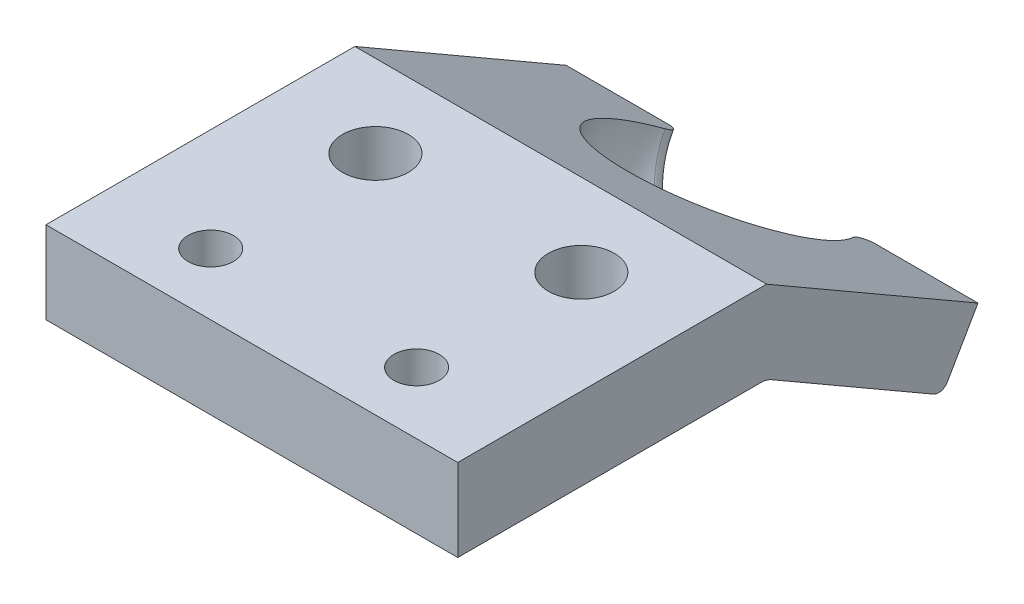
ISO-10303-21;
HEADER;
FILE_DESCRIPTION(('STEP AP214'),'2;1');
FILE_NAME('part.step','',(''),(''),'','','');
FILE_SCHEMA(('AUTOMOTIVE_DESIGN { 1 0 10303 214 1 1 1 1 }'));
ENDSEC;
DATA;
#1=APPLICATION_CONTEXT('core data for automotive mechanical design processes');
#2=APPLICATION_PROTOCOL_DEFINITION('international standard','automotive_design',2000,#1);
#3=PRODUCT_CONTEXT('',#1,'mechanical');
#4=PRODUCT('Part','Part','',(#3));
#5=PRODUCT_RELATED_PRODUCT_CATEGORY('part','',(#4));
#6=PRODUCT_DEFINITION_FORMATION('','',#4);
#7=PRODUCT_DEFINITION_CONTEXT('part definition',#1,'design');
#8=PRODUCT_DEFINITION('design','',#6,#7);
#9=PRODUCT_DEFINITION_SHAPE('','',#8);
#10=(LENGTH_UNIT() NAMED_UNIT(*) SI_UNIT(.MILLI.,.METRE.));
#11=(NAMED_UNIT(*) PLANE_ANGLE_UNIT() SI_UNIT($,.RADIAN.));
#12=(NAMED_UNIT(*) SI_UNIT($,.STERADIAN.) SOLID_ANGLE_UNIT());
#13=UNCERTAINTY_MEASURE_WITH_UNIT(LENGTH_MEASURE(1.E-05),#10,'distance_accuracy_value','');
#14=(GEOMETRIC_REPRESENTATION_CONTEXT(3) GLOBAL_UNCERTAINTY_ASSIGNED_CONTEXT((#13)) GLOBAL_UNIT_ASSIGNED_CONTEXT((#10,
#11,#12)) REPRESENTATION_CONTEXT('',''));
#15=CARTESIAN_POINT('',(0.,0.,0.));
#16=DIRECTION('',(0.,0.,1.));
#17=DIRECTION('',(1.,0.,0.));
#18=AXIS2_PLACEMENT_3D('',#15,#16,#17);
#19=CARTESIAN_POINT('',(-10.,1.07179676972454,-52.));
#20=DIRECTION('',(0.,-0.499999999999998,-0.86602540378444));
#21=DIRECTION('',(0.,0.86602540378444,-0.499999999999998));
#22=AXIS2_PLACEMENT_3D('',#19,#20,#21);
#23=PLANE('',#22);
#24=DIRECTION('',(1.,0.,0.));
#25=VECTOR('',#24,1.);
#26=CARTESIAN_POINT('',(-40.4145188432738,-1.92820323027547,-50.2679491924311));
#27=LINE('',#26,#25);
#28=CARTESIAN_POINT('',(-10.,-1.92820323027547,-50.2679491924311));
#29=VERTEX_POINT('',#28);
#30=CARTESIAN_POINT('',(-5.01098792654702,-1.92820323027548,-50.2679491924311));
#31=VERTEX_POINT('',#30);
#32=EDGE_CURVE('E153',#29,#31,#27,.T.);
#33=ORIENTED_EDGE('',*,*,#32,.T.);
#34=CARTESIAN_POINT('',(0.,-1.92820323027548,-50.2679491924311));
#35=DIRECTION('',(0.,-0.499999999999998,-0.86602540378444));
#36=DIRECTION('',(0.,0.86602540378444,-0.499999999999998));
#37=AXIS2_PLACEMENT_3D('',#34,#35,#36);
#38=CIRCLE('',#37,5.01098792654702);
#39=CARTESIAN_POINT('',(-4.04030959397146,-4.49519052838326,-48.7858983848622));
#40=VERTEX_POINT('',#39);
#41=EDGE_CURVE('E231',#31,#40,#38,.F.);
#42=ORIENTED_EDGE('',*,*,#41,.T.);
#43=DIRECTION('',(1.,0.,0.));
#44=VECTOR('',#43,1.);
#45=CARTESIAN_POINT('',(-10.,-4.49519052838326,-48.7858983848622));
#46=LINE('',#45,#44);
#47=CARTESIAN_POINT('',(-10.,-4.49519052838326,-48.7858983848622));
#48=VERTEX_POINT('',#47);
#49=EDGE_CURVE('E234',#40,#48,#46,.F.);
#50=ORIENTED_EDGE('',*,*,#49,.T.);
#51=DIRECTION('',(0.,0.86602540378444,-0.499999999999998));
#52=VECTOR('',#51,1.);
#53=CARTESIAN_POINT('',(-10.,1.07179676972454,-52.));
#54=LINE('',#53,#52);
#55=EDGE_CURVE('E208',#48,#29,#54,.T.);
#56=ORIENTED_EDGE('',*,*,#55,.T.);
#57=EDGE_LOOP('',(#33,#42,#50,#56));
#58=FACE_BOUND('',#57,.T.);
#59=ADVANCED_FACE('F38',(#58),#23,.T.);
#60=CARTESIAN_POINT('',(0.,0.,0.));
#61=DIRECTION('',(0.,1.,0.));
#62=DIRECTION('',(0.,0.,1.));
#63=AXIS2_PLACEMENT_3D('',#60,#61,#62);
#64=PLANE('',#63);
#65=CARTESIAN_POINT('',(5.,0.,-36.));
#66=DIRECTION('',(0.,1.,0.));
#67=DIRECTION('',(0.,0.,1.));
#68=AXIS2_PLACEMENT_3D('',#65,#66,#67);
#69=CIRCLE('',#68,1.6);
#70=CARTESIAN_POINT('',(5.,0.,-34.4));
#71=VERTEX_POINT('',#70);
#72=EDGE_CURVE('E257',#71,#71,#69,.T.);
#73=ORIENTED_EDGE('',*,*,#72,.T.);
#74=EDGE_LOOP('',(#73));
#75=FACE_BOUND('',#74,.T.);
#76=CARTESIAN_POINT('',(-5.,0.,-28.));
#77=DIRECTION('',(0.,1.,0.));
#78=DIRECTION('',(0.,0.,1.));
#79=AXIS2_PLACEMENT_3D('',#76,#77,#78);
#80=CIRCLE('',#79,1.1);
#81=CARTESIAN_POINT('',(-5.,0.,-26.9));
#82=VERTEX_POINT('',#81);
#83=EDGE_CURVE('E283',#82,#82,#80,.T.);
#84=ORIENTED_EDGE('',*,*,#83,.T.);
#85=EDGE_LOOP('',(#84));
#86=FACE_BOUND('',#85,.T.);
#87=CARTESIAN_POINT('',(5.,0.,-28.));
#88=DIRECTION('',(0.,1.,0.));
#89=DIRECTION('',(0.,0.,1.));
#90=AXIS2_PLACEMENT_3D('',#87,#88,#89);
#91=CIRCLE('',#90,1.1);
#92=CARTESIAN_POINT('',(5.,0.,-26.9));
#93=VERTEX_POINT('',#92);
#94=EDGE_CURVE('E279',#93,#93,#91,.T.);
#95=ORIENTED_EDGE('',*,*,#94,.T.);
#96=EDGE_LOOP('',(#95));
#97=FACE_BOUND('',#96,.T.);
#98=CARTESIAN_POINT('',(-5.,0.,-36.));
#99=DIRECTION('',(0.,1.,0.));
#100=DIRECTION('',(0.,0.,1.));
#101=AXIS2_PLACEMENT_3D('',#98,#99,#100);
#102=CIRCLE('',#101,1.6);
#103=CARTESIAN_POINT('',(-5.,0.,-34.4));
#104=VERTEX_POINT('',#103);
#105=EDGE_CURVE('E155',#104,#104,#102,.T.);
#106=ORIENTED_EDGE('',*,*,#105,.T.);
#107=EDGE_LOOP('',(#106));
#108=FACE_BOUND('',#107,.T.);
#109=DIRECTION('',(0.,0.,-1.));
#110=VECTOR('',#109,1.);
#111=CARTESIAN_POINT('',(-10.,0.,0.));
#112=LINE('',#111,#110);
#113=CARTESIAN_POINT('',(-10.,0.,-25.));
#114=VERTEX_POINT('',#113);
#115=CARTESIAN_POINT('',(-10.,0.,-39.7320508075689));
#116=VERTEX_POINT('',#115);
#117=EDGE_CURVE('E175',#114,#116,#112,.T.);
#118=ORIENTED_EDGE('',*,*,#117,.T.);
#119=DIRECTION('',(1.,0.,0.));
#120=VECTOR('',#119,1.);
#121=CARTESIAN_POINT('',(0.,0.,-39.7320508075689));
#122=LINE('',#121,#120);
#123=CARTESIAN_POINT('',(10.,0.,-39.7320508075689));
#124=VERTEX_POINT('',#123);
#125=EDGE_CURVE('E295',#116,#124,#122,.T.);
#126=ORIENTED_EDGE('',*,*,#125,.T.);
#127=DIRECTION('',(0.,0.,1.));
#128=VECTOR('',#127,1.);
#129=CARTESIAN_POINT('',(9.99999999999999,0.,0.));
#130=LINE('',#129,#128);
#131=CARTESIAN_POINT('',(10.,0.,-25.));
#132=VERTEX_POINT('',#131);
#133=EDGE_CURVE('E326',#124,#132,#130,.T.);
#134=ORIENTED_EDGE('',*,*,#133,.T.);
#135=DIRECTION('',(1.,0.,0.));
#136=VECTOR('',#135,1.);
#137=CARTESIAN_POINT('',(-40.4145188432738,0.,-25.));
#138=LINE('',#137,#136);
#139=EDGE_CURVE('E168',#114,#132,#138,.T.);
#140=ORIENTED_EDGE('',*,*,#139,.F.);
#141=EDGE_LOOP('',(#118,#126,#134,#140));
#142=FACE_BOUND('',#141,.T.);
#143=ADVANCED_FACE('F324',(#75,#86,#97,#108,#142),#64,.F.);
#144=CARTESIAN_POINT('',(5.01098792654702,-1.92820323027548,-50.2679491924311));
#145=VERTEX_POINT('',#144);
#146=CARTESIAN_POINT('',(10.,-1.92820323027547,-50.2679491924311));
#147=VERTEX_POINT('',#146);
#148=EDGE_CURVE('E161',#145,#147,#27,.T.);
#149=ORIENTED_EDGE('',*,*,#148,.T.);
#150=DIRECTION('',(0.,0.86602540378444,-0.499999999999998));
#151=VECTOR('',#150,1.);
#152=CARTESIAN_POINT('',(10.,1.07179676972454,-52.));
#153=LINE('',#152,#151);
#154=CARTESIAN_POINT('',(10.,-4.49519052838326,-48.7858983848622));
#155=VERTEX_POINT('',#154);
#156=EDGE_CURVE('E200',#155,#147,#153,.T.);
#157=ORIENTED_EDGE('',*,*,#156,.F.);
#158=DIRECTION('',(1.,0.,0.));
#159=VECTOR('',#158,1.);
#160=CARTESIAN_POINT('',(-10.,-4.49519052838326,-48.7858983848622));
#161=LINE('',#160,#159);
#162=CARTESIAN_POINT('',(4.04030959397146,-4.49519052838326,-48.7858983848622));
#163=VERTEX_POINT('',#162);
#164=EDGE_CURVE('E228',#155,#163,#161,.F.);
#165=ORIENTED_EDGE('',*,*,#164,.T.);
#166=CARTESIAN_POINT('',(0.,-1.92820323027548,-50.2679491924311));
#167=DIRECTION('',(0.,-0.499999999999998,-0.86602540378444));
#168=DIRECTION('',(0.,0.86602540378444,-0.499999999999998));
#169=AXIS2_PLACEMENT_3D('',#166,#167,#168);
#170=CIRCLE('',#169,5.01098792654702);
#171=EDGE_CURVE('E224',#163,#145,#170,.F.);
#172=ORIENTED_EDGE('',*,*,#171,.T.);
#173=EDGE_LOOP('',(#149,#157,#165,#172));
#174=FACE_BOUND('',#173,.T.);
#175=ADVANCED_FACE('F356',(#174),#23,.T.);
#176=CARTESIAN_POINT('',(-10.,0.,-40.));
#177=DIRECTION('',(0.,-0.86602540378444,0.499999999999998));
#178=DIRECTION('',(0.,-0.499999999999998,-0.86602540378444));
#179=AXIS2_PLACEMENT_3D('',#176,#177,#178);
#180=PLANE('',#179);
#181=DIRECTION('',(0.,-0.499999999999998,-0.86602540378444));
#182=VECTOR('',#181,1.);
#183=CARTESIAN_POINT('',(10.,0.,-40.));
#184=LINE('',#183,#182);
#185=CARTESIAN_POINT('',(10.,-0.13397459621556,-40.2320508075689));
#186=VERTEX_POINT('',#185);
#187=CARTESIAN_POINT('',(10.,-4.67820323027548,-48.10288568297));
#188=VERTEX_POINT('',#187);
#189=EDGE_CURVE('E197',#186,#188,#184,.T.);
#190=ORIENTED_EDGE('',*,*,#189,.F.);
#191=DIRECTION('',(1.,0.,0.));
#192=VECTOR('',#191,1.);
#193=CARTESIAN_POINT('',(-10.,-0.13397459621556,-40.2320508075689));
#194=LINE('',#193,#192);
#195=CARTESIAN_POINT('',(-10.,-0.13397459621556,-40.2320508075689));
#196=VERTEX_POINT('',#195);
#197=EDGE_CURVE('E54',#186,#196,#194,.F.);
#198=ORIENTED_EDGE('',*,*,#197,.T.);
#199=DIRECTION('',(0.,-0.499999999999998,-0.86602540378444));
#200=VECTOR('',#199,1.);
#201=CARTESIAN_POINT('',(-10.,0.,-40.));
#202=LINE('',#201,#200);
#203=CARTESIAN_POINT('',(-10.,-4.67820323027548,-48.10288568297));
#204=VERTEX_POINT('',#203);
#205=EDGE_CURVE('E205',#196,#204,#202,.T.);
#206=ORIENTED_EDGE('',*,*,#205,.T.);
#207=DIRECTION('',(1.,0.,0.));
#208=VECTOR('',#207,1.);
#209=CARTESIAN_POINT('',(-10.,-4.67820323027548,-48.10288568297));
#210=LINE('',#209,#208);
#211=CARTESIAN_POINT('',(-4.04030959397146,-4.67820323027548,-48.10288568297));
#212=VERTEX_POINT('',#211);
#213=EDGE_CURVE('E214',#204,#212,#210,.T.);
#214=ORIENTED_EDGE('',*,*,#213,.T.);
#215=CARTESIAN_POINT('',(0.,-3.42820323027549,-45.9378221735089));
#216=DIRECTION('',(0.,-0.86602540378444,0.499999999999998));
#217=DIRECTION('',(0.,-0.499999999999998,-0.86602540378444));
#218=AXIS2_PLACEMENT_3D('',#215,#216,#217);
#219=CIRCLE('',#218,4.75122106569856);
#220=CARTESIAN_POINT('',(4.04030959397146,-4.67820323027548,-48.10288568297));
#221=VERTEX_POINT('',#220);
#222=EDGE_CURVE('E211',#212,#221,#219,.F.);
#223=ORIENTED_EDGE('',*,*,#222,.T.);
#224=DIRECTION('',(1.,0.,0.));
#225=VECTOR('',#224,1.);
#226=CARTESIAN_POINT('',(-10.,-4.67820323027548,-48.10288568297));
#227=LINE('',#226,#225);
#228=EDGE_CURVE('E217',#221,#188,#227,.T.);
#229=ORIENTED_EDGE('',*,*,#228,.T.);
#230=EDGE_LOOP('',(#190,#198,#206,#214,#223,#229));
#231=FACE_BOUND('',#230,.T.);
#232=ADVANCED_FACE('F366',(#231),#180,.T.);
#233=CARTESIAN_POINT('',(-10.,0.,0.));
#234=DIRECTION('',(-1.,0.,0.));
#235=DIRECTION('',(0.,0.,1.));
#236=AXIS2_PLACEMENT_3D('',#233,#234,#235);
#237=PLANE('',#236);
#238=DIRECTION('',(0.,0.499999999999998,0.86602540378444));
#239=VECTOR('',#238,1.);
#240=CARTESIAN_POINT('',(-10.,20.3205080756887,-11.7320508075688));
#241=LINE('',#240,#239);
#242=CARTESIAN_POINT('',(-10.,4.,-40.));
#243=VERTEX_POINT('',#242);
#244=EDGE_CURVE('E136',#29,#243,#241,.T.);
#245=ORIENTED_EDGE('',*,*,#244,.F.);
#246=ORIENTED_EDGE('',*,*,#55,.F.);
#247=CARTESIAN_POINT('',(-10.,-4.24519052838326,-48.35288568297));
#248=DIRECTION('',(-1.,0.,0.));
#249=DIRECTION('',(0.,0.,1.));
#250=AXIS2_PLACEMENT_3D('',#247,#248,#249);
#251=CIRCLE('',#250,0.5);
#252=EDGE_CURVE('E237',#48,#204,#251,.T.);
#253=ORIENTED_EDGE('',*,*,#252,.T.);
#254=ORIENTED_EDGE('',*,*,#205,.F.);
#255=CARTESIAN_POINT('',(-10.,-1.,-39.7320508075689));
#256=DIRECTION('',(-1.,0.,0.));
#257=DIRECTION('',(0.,0.,1.));
#258=AXIS2_PLACEMENT_3D('',#255,#256,#257);
#259=CIRCLE('',#258,1.);
#260=EDGE_CURVE('E11',#196,#116,#259,.F.);
#261=ORIENTED_EDGE('',*,*,#260,.T.);
#262=ORIENTED_EDGE('',*,*,#117,.F.);
#263=DIRECTION('',(0.,1.,0.));
#264=VECTOR('',#263,1.);
#265=CARTESIAN_POINT('',(-10.,-4.74519052838327,-25.));
#266=LINE('',#265,#264);
#267=CARTESIAN_POINT('',(-10.,4.,-25.));
#268=VERTEX_POINT('',#267);
#269=EDGE_CURVE('E139',#114,#268,#266,.T.);
#270=ORIENTED_EDGE('',*,*,#269,.T.);
#271=DIRECTION('',(0.,0.,-1.));
#272=VECTOR('',#271,1.);
#273=CARTESIAN_POINT('',(-10.,4.,-25.));
#274=LINE('',#273,#272);
#275=EDGE_CURVE('E132',#268,#243,#274,.T.);
#276=ORIENTED_EDGE('',*,*,#275,.T.);
#277=EDGE_LOOP('',(#245,#246,#253,#254,#261,#262,#270,#276));
#278=FACE_BOUND('',#277,.T.);
#279=ADVANCED_FACE('F134',(#278),#237,.T.);
#280=CARTESIAN_POINT('',(10.,0.,0.));
#281=DIRECTION('',(-1.,0.,0.));
#282=DIRECTION('',(0.,0.,1.));
#283=AXIS2_PLACEMENT_3D('',#280,#281,#282);
#284=PLANE('',#283);
#285=ORIENTED_EDGE('',*,*,#156,.T.);
#286=DIRECTION('',(0.,0.499999999999998,0.86602540378444));
#287=VECTOR('',#286,1.);
#288=CARTESIAN_POINT('',(10.,20.3205080756887,-11.7320508075688));
#289=LINE('',#288,#287);
#290=CARTESIAN_POINT('',(10.,4.,-40.));
#291=VERTEX_POINT('',#290);
#292=EDGE_CURVE('E156',#147,#291,#289,.T.);
#293=ORIENTED_EDGE('',*,*,#292,.T.);
#294=DIRECTION('',(0.,0.,1.));
#295=VECTOR('',#294,1.);
#296=CARTESIAN_POINT('',(10.,4.,-25.));
#297=LINE('',#296,#295);
#298=CARTESIAN_POINT('',(10.,4.,-25.));
#299=VERTEX_POINT('',#298);
#300=EDGE_CURVE('E159',#291,#299,#297,.T.);
#301=ORIENTED_EDGE('',*,*,#300,.T.);
#302=DIRECTION('',(0.,1.,0.));
#303=VECTOR('',#302,1.);
#304=CARTESIAN_POINT('',(10.,-4.74519052838327,-25.));
#305=LINE('',#304,#303);
#306=EDGE_CURVE('E145',#132,#299,#305,.T.);
#307=ORIENTED_EDGE('',*,*,#306,.F.);
#308=ORIENTED_EDGE('',*,*,#133,.F.);
#309=CARTESIAN_POINT('',(10.,-1.,-39.7320508075689));
#310=DIRECTION('',(-1.,0.,0.));
#311=DIRECTION('',(0.,0.,1.));
#312=AXIS2_PLACEMENT_3D('',#309,#310,#311);
#313=CIRCLE('',#312,1.);
#314=EDGE_CURVE('E47',#124,#186,#313,.T.);
#315=ORIENTED_EDGE('',*,*,#314,.T.);
#316=ORIENTED_EDGE('',*,*,#189,.T.);
#317=CARTESIAN_POINT('',(10.,-4.24519052838326,-48.35288568297));
#318=DIRECTION('',(-1.,0.,0.));
#319=DIRECTION('',(0.,0.,1.));
#320=AXIS2_PLACEMENT_3D('',#317,#318,#319);
#321=CIRCLE('',#320,0.5);
#322=EDGE_CURVE('E221',#188,#155,#321,.F.);
#323=ORIENTED_EDGE('',*,*,#322,.T.);
#324=EDGE_LOOP('',(#285,#293,#301,#307,#308,#315,#316,#323));
#325=FACE_BOUND('',#324,.T.);
#326=ADVANCED_FACE('F328',(#325),#284,.F.);
#327=CARTESIAN_POINT('',(0.,-0.428203230275491,-47.6698729810778));
#328=DIRECTION('',(0.,0.866025403784439,-0.5));
#329=DIRECTION('',(0.,0.5,0.866025403784439));
#330=AXIS2_PLACEMENT_3D('',#327,#328,#329);
#331=SPHERICAL_SURFACE('',#330,5.1);
#332=CARTESIAN_POINT('',(0.,-0.428203230275485,-47.6698729810778));
#333=DIRECTION('',(0.,-0.86602540378444,0.499999999999998));
#334=DIRECTION('',(0.,-0.499999999999998,-0.86602540378444));
#335=AXIS2_PLACEMENT_3D('',#332,#333,#334);
#336=CIRCLE('',#335,5.1);
#337=CARTESIAN_POINT('',(4.56357829024818,-1.56659608741833,-49.6416272486227));
#338=VERTEX_POINT('',#337);
#339=CARTESIAN_POINT('',(-4.56357829024818,-1.56659608741833,-49.6416272486227));
#340=VERTEX_POINT('',#339);
#341=EDGE_CURVE('E189',#338,#340,#336,.T.);
#342=ORIENTED_EDGE('',*,*,#341,.F.);
#343=CARTESIAN_POINT('',(0.,-1.56659608741834,-49.6416272486227));
#344=DIRECTION('',(0.,0.499999999999998,0.86602540378444));
#345=DIRECTION('',(0.,-0.86602540378444,0.499999999999998));
#346=AXIS2_PLACEMENT_3D('',#343,#344,#345);
#347=CIRCLE('',#346,4.56357829024818);
#348=CARTESIAN_POINT('',(3.67956766593829,-3.90438809105221,-48.2919024060154));
#349=VERTEX_POINT('',#348);
#350=EDGE_CURVE('E241',#338,#349,#347,.F.);
#351=ORIENTED_EDGE('',*,*,#350,.T.);
#352=CARTESIAN_POINT('',(0.,-2.76599523390937,-46.3201481384704));
#353=DIRECTION('',(0.,0.86602540378444,-0.499999999999998));
#354=DIRECTION('',(0.,0.499999999999998,0.86602540378444));
#355=AXIS2_PLACEMENT_3D('',#352,#353,#354);
#356=CIRCLE('',#355,4.32700489911833);
#357=CARTESIAN_POINT('',(-3.67956766593829,-3.90438809105221,-48.2919024060154));
#358=VERTEX_POINT('',#357);
#359=EDGE_CURVE('E244',#349,#358,#356,.F.);
#360=ORIENTED_EDGE('',*,*,#359,.T.);
#361=CARTESIAN_POINT('',(0.,-1.56659608741834,-49.6416272486227));
#362=DIRECTION('',(0.,0.499999999999998,0.86602540378444));
#363=DIRECTION('',(0.,-0.86602540378444,0.499999999999998));
#364=AXIS2_PLACEMENT_3D('',#361,#362,#363);
#365=CIRCLE('',#364,4.56357829024818);
#366=EDGE_CURVE('E247',#358,#340,#365,.F.);
#367=ORIENTED_EDGE('',*,*,#366,.T.);
#368=EDGE_LOOP('',(#342,#351,#360,#367));
#369=FACE_BOUND('',#368,.T.);
#370=ADVANCED_FACE('F393',(#369),#331,.F.);
#371=CARTESIAN_POINT('',(0.,-1.67820323027548,-49.8349364905389));
#372=DIRECTION('',(0.,-0.499999999999998,-0.86602540378444));
#373=DIRECTION('',(0.,0.86602540378444,-0.499999999999998));
#374=AXIS2_PLACEMENT_3D('',#371,#372,#373);
#375=TOROIDAL_SURFACE('',#374,5.01098792654702,0.5);
#376=CARTESIAN_POINT('',(-5.01098792654702,-1.67820323027548,-49.8349364905389));
#377=DIRECTION('',(0.,-0.86602540378444,0.499999999999998));
#378=DIRECTION('',(0.,-0.499999999999998,-0.86602540378444));
#379=AXIS2_PLACEMENT_3D('',#376,#377,#378);
#380=CIRCLE('',#379,0.5);
#381=EDGE_CURVE('E192',#340,#31,#380,.F.);
#382=ORIENTED_EDGE('',*,*,#381,.F.);
#383=ORIENTED_EDGE('',*,*,#366,.F.);
#384=CARTESIAN_POINT('',(-4.04030959397146,-4.24519052838326,-48.35288568297));
#385=DIRECTION('',(0.591520406472072,-0.698267646784053,0.403145013837175));
#386=DIRECTION('',(0.763020538683633,0.646374239544661,0.));
#387=AXIS2_PLACEMENT_3D('',#384,#385,#386);
#388=CIRCLE('',#387,0.5);
#389=EDGE_CURVE('E201',#40,#358,#388,.T.);
#390=ORIENTED_EDGE('',*,*,#389,.F.);
#391=ORIENTED_EDGE('',*,*,#41,.F.);
#392=EDGE_LOOP('',(#382,#383,#390,#391));
#393=FACE_BOUND('',#392,.T.);
#394=ADVANCED_FACE('F308',(#393),#375,.T.);
#395=CARTESIAN_POINT('',(-10.,-4.24519052838326,-48.35288568297));
#396=DIRECTION('',(1.,0.,0.));
#397=DIRECTION('',(0.,0.,-1.));
#398=AXIS2_PLACEMENT_3D('',#395,#396,#397);
#399=CYLINDRICAL_SURFACE('',#398,0.5);
#400=ORIENTED_EDGE('',*,*,#252,.F.);
#401=ORIENTED_EDGE('',*,*,#49,.F.);
#402=CARTESIAN_POINT('',(-4.04030959397146,-4.24519052838326,-48.35288568297));
#403=DIRECTION('',(1.,0.,0.));
#404=DIRECTION('',(0.,0.,-1.));
#405=AXIS2_PLACEMENT_3D('',#402,#403,#404);
#406=CIRCLE('',#405,0.5);
#407=EDGE_CURVE('E269',#212,#40,#406,.T.);
#408=ORIENTED_EDGE('',*,*,#407,.F.);
#409=ORIENTED_EDGE('',*,*,#213,.F.);
#410=EDGE_LOOP('',(#400,#401,#408,#409));
#411=FACE_BOUND('',#410,.T.);
#412=ADVANCED_FACE('F318',(#411),#399,.T.);
#413=CARTESIAN_POINT('',(-4.04030959397146,-4.24519052838326,-48.35288568297));
#414=DIRECTION('',(0.,0.,1.));
#415=DIRECTION('',(1.,0.,0.));
#416=AXIS2_PLACEMENT_3D('',#413,#414,#415);
#417=SPHERICAL_SURFACE('',#416,0.5);
#418=ORIENTED_EDGE('',*,*,#407,.T.);
#419=ORIENTED_EDGE('',*,*,#389,.T.);
#420=CARTESIAN_POINT('',(-4.04030959397145,-4.24519052838326,-48.35288568297));
#421=DIRECTION('',(0.526180526107014,-0.425186445558226,-0.736444526396461));
#422=DIRECTION('',(-0.813655747859229,0.,-0.581346991026563));
#423=AXIS2_PLACEMENT_3D('',#420,#421,#422);
#424=CIRCLE('',#423,0.5);
#425=EDGE_CURVE('E265',#212,#358,#424,.F.);
#426=ORIENTED_EDGE('',*,*,#425,.F.);
#427=EDGE_LOOP('',(#418,#419,#426));
#428=FACE_BOUND('',#427,.T.);
#429=ADVANCED_FACE('F313',(#428),#417,.T.);
#430=CARTESIAN_POINT('',(0.,-1.67820323027548,-49.8349364905389));
#431=DIRECTION('',(0.,-0.499999999999998,-0.86602540378444));
#432=DIRECTION('',(0.,0.86602540378444,-0.499999999999998));
#433=AXIS2_PLACEMENT_3D('',#430,#431,#432);
#434=TOROIDAL_SURFACE('',#433,5.01098792654702,0.5);
#435=CARTESIAN_POINT('',(5.01098792654702,-1.67820323027548,-49.8349364905389));
#436=DIRECTION('',(0.,-0.86602540378444,0.499999999999998));
#437=DIRECTION('',(0.,-0.499999999999998,-0.86602540378444));
#438=AXIS2_PLACEMENT_3D('',#435,#436,#437);
#439=CIRCLE('',#438,0.5);
#440=EDGE_CURVE('E251',#145,#338,#439,.F.);
#441=ORIENTED_EDGE('',*,*,#440,.F.);
#442=ORIENTED_EDGE('',*,*,#171,.F.);
#443=CARTESIAN_POINT('',(4.04030959397145,-4.24519052838326,-48.35288568297));
#444=DIRECTION('',(-0.591520406472078,-0.698267646784051,0.403145013837169));
#445=DIRECTION('',(0.763020538683629,-0.646374239544666,0.));
#446=AXIS2_PLACEMENT_3D('',#443,#444,#445);
#447=CIRCLE('',#446,0.5);
#448=EDGE_CURVE('E261',#349,#163,#447,.T.);
#449=ORIENTED_EDGE('',*,*,#448,.F.);
#450=ORIENTED_EDGE('',*,*,#350,.F.);
#451=EDGE_LOOP('',(#441,#442,#449,#450));
#452=FACE_BOUND('',#451,.T.);
#453=ADVANCED_FACE('F390',(#452),#434,.T.);
#454=CARTESIAN_POINT('',(0.,-2.99519052838327,-46.1878221735089));
#455=DIRECTION('',(0.,-0.86602540378444,0.499999999999998));
#456=DIRECTION('',(0.,-0.499999999999998,-0.86602540378444));
#457=AXIS2_PLACEMENT_3D('',#454,#455,#456);
#458=TOROIDAL_SURFACE('',#457,4.75122106569856,0.5);
#459=ORIENTED_EDGE('',*,*,#425,.T.);
#460=ORIENTED_EDGE('',*,*,#359,.F.);
#461=CARTESIAN_POINT('',(4.04030959397146,-4.24519052838326,-48.35288568297));
#462=DIRECTION('',(-0.52618052610701,-0.425186445558225,-0.736444526396465));
#463=DIRECTION('',(-0.813655747859233,0.,0.581346991026558));
#464=AXIS2_PLACEMENT_3D('',#461,#462,#463);
#465=CIRCLE('',#464,0.5);
#466=EDGE_CURVE('E256',#221,#349,#465,.T.);
#467=ORIENTED_EDGE('',*,*,#466,.F.);
#468=ORIENTED_EDGE('',*,*,#222,.F.);
#469=EDGE_LOOP('',(#459,#460,#467,#468));
#470=FACE_BOUND('',#469,.T.);
#471=ADVANCED_FACE('F384',(#470),#458,.T.);
#472=CARTESIAN_POINT('',(4.04030959397146,-4.24519052838326,-48.35288568297));
#473=DIRECTION('',(0.,0.,1.));
#474=DIRECTION('',(1.,0.,0.));
#475=AXIS2_PLACEMENT_3D('',#472,#473,#474);
#476=SPHERICAL_SURFACE('',#475,0.5);
#477=ORIENTED_EDGE('',*,*,#466,.T.);
#478=ORIENTED_EDGE('',*,*,#448,.T.);
#479=CARTESIAN_POINT('',(4.04030959397146,-4.24519052838326,-48.35288568297));
#480=DIRECTION('',(-1.,0.,0.));
#481=DIRECTION('',(0.,0.,1.));
#482=AXIS2_PLACEMENT_3D('',#479,#480,#481);
#483=CIRCLE('',#482,0.5);
#484=EDGE_CURVE('E252',#221,#163,#483,.F.);
#485=ORIENTED_EDGE('',*,*,#484,.F.);
#486=EDGE_LOOP('',(#477,#478,#485));
#487=FACE_BOUND('',#486,.T.);
#488=ADVANCED_FACE('F387',(#487),#476,.T.);
#489=CARTESIAN_POINT('',(-10.,-4.24519052838326,-48.35288568297));
#490=DIRECTION('',(1.,0.,0.));
#491=DIRECTION('',(0.,0.,-1.));
#492=AXIS2_PLACEMENT_3D('',#489,#490,#491);
#493=CYLINDRICAL_SURFACE('',#492,0.5);
#494=ORIENTED_EDGE('',*,*,#484,.T.);
#495=ORIENTED_EDGE('',*,*,#164,.F.);
#496=ORIENTED_EDGE('',*,*,#322,.F.);
#497=ORIENTED_EDGE('',*,*,#228,.F.);
#498=EDGE_LOOP('',(#494,#495,#496,#497));
#499=FACE_BOUND('',#498,.T.);
#500=ADVANCED_FACE('F379',(#499),#493,.T.);
#501=CARTESIAN_POINT('',(-5.,-4.74519052838326,-36.));
#502=DIRECTION('',(0.,1.,0.));
#503=DIRECTION('',(0.,0.,1.));
#504=AXIS2_PLACEMENT_3D('',#501,#502,#503);
#505=CYLINDRICAL_SURFACE('',#504,1.6);
#506=CARTESIAN_POINT('',(-5.,4.,-36.));
#507=DIRECTION('',(0.,-1.,0.));
#508=DIRECTION('',(0.,0.,-1.));
#509=AXIS2_PLACEMENT_3D('',#506,#507,#508);
#510=CIRCLE('',#509,1.6);
#511=CARTESIAN_POINT('',(-5.,4.,-37.6));
#512=VERTEX_POINT('',#511);
#513=EDGE_CURVE('E185',#512,#512,#510,.F.);
#514=ORIENTED_EDGE('',*,*,#513,.T.);
#515=EDGE_LOOP('',(#514));
#516=FACE_BOUND('',#515,.T.);
#517=ORIENTED_EDGE('',*,*,#105,.F.);
#518=EDGE_LOOP('',(#517));
#519=FACE_BOUND('',#518,.T.);
#520=ADVANCED_FACE('F403',(#516,#519),#505,.F.);
#521=CARTESIAN_POINT('',(5.,-4.74519052838326,-28.));
#522=DIRECTION('',(0.,1.,0.));
#523=DIRECTION('',(0.,0.,1.));
#524=AXIS2_PLACEMENT_3D('',#521,#522,#523);
#525=CYLINDRICAL_SURFACE('',#524,1.1);
#526=CARTESIAN_POINT('',(5.,4.,-28.));
#527=DIRECTION('',(0.,-1.,0.));
#528=DIRECTION('',(0.,0.,-1.));
#529=AXIS2_PLACEMENT_3D('',#526,#527,#528);
#530=CIRCLE('',#529,1.1);
#531=CARTESIAN_POINT('',(5.,4.,-29.1));
#532=VERTEX_POINT('',#531);
#533=EDGE_CURVE('E180',#532,#532,#530,.F.);
#534=ORIENTED_EDGE('',*,*,#533,.T.);
#535=EDGE_LOOP('',(#534));
#536=FACE_BOUND('',#535,.T.);
#537=ORIENTED_EDGE('',*,*,#94,.F.);
#538=EDGE_LOOP('',(#537));
#539=FACE_BOUND('',#538,.T.);
#540=ADVANCED_FACE('F448',(#536,#539),#525,.F.);
#541=CARTESIAN_POINT('',(-5.,-4.74519052838326,-28.));
#542=DIRECTION('',(0.,1.,0.));
#543=DIRECTION('',(0.,0.,1.));
#544=AXIS2_PLACEMENT_3D('',#541,#542,#543);
#545=CYLINDRICAL_SURFACE('',#544,1.1);
#546=CARTESIAN_POINT('',(-5.,4.,-28.));
#547=DIRECTION('',(0.,-1.,0.));
#548=DIRECTION('',(0.,0.,-1.));
#549=AXIS2_PLACEMENT_3D('',#546,#547,#548);
#550=CIRCLE('',#549,1.1);
#551=CARTESIAN_POINT('',(-5.,4.,-29.1));
#552=VERTEX_POINT('',#551);
#553=EDGE_CURVE('E176',#552,#552,#550,.F.);
#554=ORIENTED_EDGE('',*,*,#553,.T.);
#555=EDGE_LOOP('',(#554));
#556=FACE_BOUND('',#555,.T.);
#557=ORIENTED_EDGE('',*,*,#83,.F.);
#558=EDGE_LOOP('',(#557));
#559=FACE_BOUND('',#558,.T.);
#560=ADVANCED_FACE('F349',(#556,#559),#545,.F.);
#561=CARTESIAN_POINT('',(5.,-4.74519052838326,-36.));
#562=DIRECTION('',(0.,1.,0.));
#563=DIRECTION('',(0.,0.,1.));
#564=AXIS2_PLACEMENT_3D('',#561,#562,#563);
#565=CYLINDRICAL_SURFACE('',#564,1.6);
#566=CARTESIAN_POINT('',(5.,4.,-36.));
#567=DIRECTION('',(0.,-1.,0.));
#568=DIRECTION('',(0.,0.,-1.));
#569=AXIS2_PLACEMENT_3D('',#566,#567,#568);
#570=CIRCLE('',#569,1.6);
#571=CARTESIAN_POINT('',(5.,4.,-37.6));
#572=VERTEX_POINT('',#571);
#573=EDGE_CURVE('E181',#572,#572,#570,.F.);
#574=ORIENTED_EDGE('',*,*,#573,.T.);
#575=EDGE_LOOP('',(#574));
#576=FACE_BOUND('',#575,.T.);
#577=ORIENTED_EDGE('',*,*,#72,.F.);
#578=EDGE_LOOP('',(#577));
#579=FACE_BOUND('',#578,.T.);
#580=ADVANCED_FACE('F342',(#576,#579),#565,.F.);
#581=CARTESIAN_POINT('',(-40.4145188432738,4.,-25.));
#582=DIRECTION('',(0.,0.,-1.));
#583=DIRECTION('',(-1.,0.,0.));
#584=AXIS2_PLACEMENT_3D('',#581,#582,#583);
#585=PLANE('',#584);
#586=DIRECTION('',(1.,0.,0.));
#587=VECTOR('',#586,1.);
#588=CARTESIAN_POINT('',(-40.4145188432738,4.,-25.));
#589=LINE('',#588,#587);
#590=EDGE_CURVE('E162',#268,#299,#589,.T.);
#591=ORIENTED_EDGE('',*,*,#590,.F.);
#592=ORIENTED_EDGE('',*,*,#269,.F.);
#593=ORIENTED_EDGE('',*,*,#139,.T.);
#594=ORIENTED_EDGE('',*,*,#306,.T.);
#595=EDGE_LOOP('',(#591,#592,#593,#594));
#596=FACE_BOUND('',#595,.T.);
#597=ADVANCED_FACE('F340',(#596),#585,.F.);
#598=CARTESIAN_POINT('',(-40.4145188432738,-1.92820323027547,-50.2679491924311));
#599=DIRECTION('',(0.,-0.86602540378444,0.499999999999998));
#600=DIRECTION('',(0.,-0.499999999999998,-0.86602540378444));
#601=AXIS2_PLACEMENT_3D('',#598,#599,#600);
#602=PLANE('',#601);
#603=ORIENTED_EDGE('',*,*,#244,.T.);
#604=DIRECTION('',(1.,0.,0.));
#605=VECTOR('',#604,1.);
#606=CARTESIAN_POINT('',(-40.4145188432738,4.,-40.));
#607=LINE('',#606,#605);
#608=EDGE_CURVE('E150',#243,#291,#607,.T.);
#609=ORIENTED_EDGE('',*,*,#608,.T.);
#610=ORIENTED_EDGE('',*,*,#292,.F.);
#611=ORIENTED_EDGE('',*,*,#148,.F.);
#612=ORIENTED_EDGE('',*,*,#440,.T.);
#613=ORIENTED_EDGE('',*,*,#341,.T.);
#614=ORIENTED_EDGE('',*,*,#381,.T.);
#615=ORIENTED_EDGE('',*,*,#32,.F.);
#616=EDGE_LOOP('',(#603,#609,#610,#611,#612,#613,#614,#615));
#617=FACE_BOUND('',#616,.T.);
#618=ADVANCED_FACE('F149',(#617),#602,.F.);
#619=CARTESIAN_POINT('',(-40.4145188432738,4.,-40.));
#620=DIRECTION('',(0.,-1.,0.));
#621=DIRECTION('',(0.,0.,-1.));
#622=AXIS2_PLACEMENT_3D('',#619,#620,#621);
#623=PLANE('',#622);
#624=ORIENTED_EDGE('',*,*,#533,.F.);
#625=EDGE_LOOP('',(#624));
#626=FACE_BOUND('',#625,.T.);
#627=ORIENTED_EDGE('',*,*,#573,.F.);
#628=EDGE_LOOP('',(#627));
#629=FACE_BOUND('',#628,.T.);
#630=ORIENTED_EDGE('',*,*,#553,.F.);
#631=EDGE_LOOP('',(#630));
#632=FACE_BOUND('',#631,.T.);
#633=ORIENTED_EDGE('',*,*,#513,.F.);
#634=EDGE_LOOP('',(#633));
#635=FACE_BOUND('',#634,.T.);
#636=ORIENTED_EDGE('',*,*,#608,.F.);
#637=ORIENTED_EDGE('',*,*,#275,.F.);
#638=ORIENTED_EDGE('',*,*,#590,.T.);
#639=ORIENTED_EDGE('',*,*,#300,.F.);
#640=EDGE_LOOP('',(#636,#637,#638,#639));
#641=FACE_BOUND('',#640,.T.);
#642=ADVANCED_FACE('F158',(#626,#629,#632,#635,#641),#623,.F.);
#643=CARTESIAN_POINT('',(0.,-1.,-39.7320508075689));
#644=DIRECTION('',(1.,0.,0.));
#645=DIRECTION('',(0.,0.,-1.));
#646=AXIS2_PLACEMENT_3D('',#643,#644,#645);
#647=CYLINDRICAL_SURFACE('',#646,1.);
#648=ORIENTED_EDGE('',*,*,#260,.F.);
#649=ORIENTED_EDGE('',*,*,#197,.F.);
#650=ORIENTED_EDGE('',*,*,#314,.F.);
#651=ORIENTED_EDGE('',*,*,#125,.F.);
#652=EDGE_LOOP('',(#648,#649,#650,#651));
#653=FACE_BOUND('',#652,.T.);
#654=ADVANCED_FACE('F40',(#653),#647,.F.);
#655=CLOSED_SHELL('',(#59,#143,#175,#232,#279,#326,#370,#394,#412,#429,#453,#471,#488,#500,#520,
#540,#560,#580,#597,#618,#642,#654));
#656=MANIFOLD_SOLID_BREP('B2',#655);
#657=ADVANCED_BREP_SHAPE_REPRESENTATION('',(#18,#656),#14);
#658=SHAPE_DEFINITION_REPRESENTATION(#9,#657);
ENDSEC;
END-ISO-10303-21;
